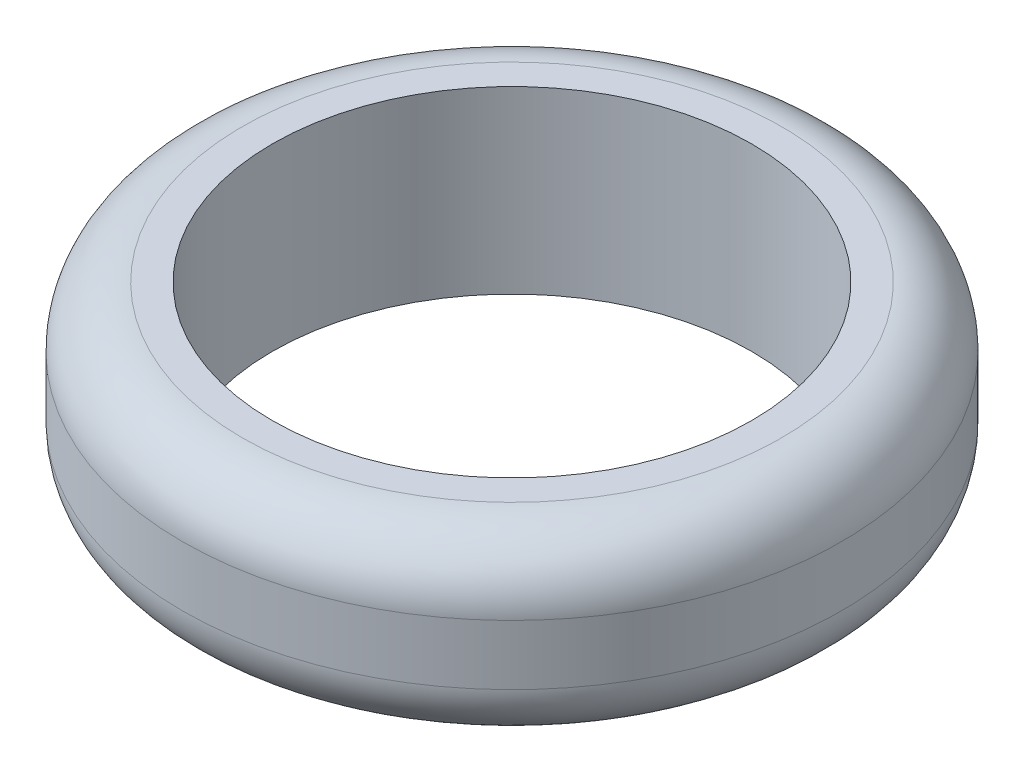
ISO-10303-21;
HEADER;
FILE_DESCRIPTION(('STEP AP214'),'2;1');
FILE_NAME('part.step','',(''),(''),'','','');
FILE_SCHEMA(('AUTOMOTIVE_DESIGN { 1 0 10303 214 1 1 1 1 }'));
ENDSEC;
DATA;
#1=APPLICATION_CONTEXT('core data for automotive mechanical design processes');
#2=APPLICATION_PROTOCOL_DEFINITION('international standard','automotive_design',2000,#1);
#3=PRODUCT_CONTEXT('',#1,'mechanical');
#4=PRODUCT('Part','Part','',(#3));
#5=PRODUCT_RELATED_PRODUCT_CATEGORY('part','',(#4));
#6=PRODUCT_DEFINITION_FORMATION('','',#4);
#7=PRODUCT_DEFINITION_CONTEXT('part definition',#1,'design');
#8=PRODUCT_DEFINITION('design','',#6,#7);
#9=PRODUCT_DEFINITION_SHAPE('','',#8);
#10=(LENGTH_UNIT() NAMED_UNIT(*) SI_UNIT(.MILLI.,.METRE.));
#11=(NAMED_UNIT(*) PLANE_ANGLE_UNIT() SI_UNIT($,.RADIAN.));
#12=(NAMED_UNIT(*) SI_UNIT($,.STERADIAN.) SOLID_ANGLE_UNIT());
#13=UNCERTAINTY_MEASURE_WITH_UNIT(LENGTH_MEASURE(1.E-05),#10,'distance_accuracy_value','');
#14=(GEOMETRIC_REPRESENTATION_CONTEXT(3) GLOBAL_UNCERTAINTY_ASSIGNED_CONTEXT((#13)) GLOBAL_UNIT_ASSIGNED_CONTEXT((#10,
#11,#12)) REPRESENTATION_CONTEXT('',''));
#15=CARTESIAN_POINT('',(0.,0.,0.));
#16=DIRECTION('',(0.,0.,1.));
#17=DIRECTION('',(1.,0.,0.));
#18=AXIS2_PLACEMENT_3D('',#15,#16,#17);
#19=CARTESIAN_POINT('',(0.,3.,0.));
#20=DIRECTION('',(0.,-1.,0.));
#21=DIRECTION('',(0.,0.,-1.));
#22=AXIS2_PLACEMENT_3D('',#19,#20,#21);
#23=CYLINDRICAL_SURFACE('',#22,5.5);
#24=CARTESIAN_POINT('',(0.,1.,0.));
#25=DIRECTION('',(0.,1.,0.));
#26=DIRECTION('',(0.,0.,1.));
#27=AXIS2_PLACEMENT_3D('',#24,#25,#26);
#28=CIRCLE('',#27,5.5);
#29=CARTESIAN_POINT('',(0.,1.,5.5));
#30=VERTEX_POINT('',#29);
#31=EDGE_CURVE('E43',#30,#30,#28,.T.);
#32=ORIENTED_EDGE('',*,*,#31,.T.);
#33=EDGE_LOOP('',(#32));
#34=FACE_BOUND('',#33,.T.);
#35=CARTESIAN_POINT('',(0.,2.,0.));
#36=DIRECTION('',(0.,1.,0.));
#37=DIRECTION('',(0.,0.,1.));
#38=AXIS2_PLACEMENT_3D('',#35,#36,#37);
#39=CIRCLE('',#38,5.5);
#40=CARTESIAN_POINT('',(0.,2.,5.5));
#41=VERTEX_POINT('',#40);
#42=EDGE_CURVE('E47',#41,#41,#39,.F.);
#43=ORIENTED_EDGE('',*,*,#42,.T.);
#44=EDGE_LOOP('',(#43));
#45=FACE_BOUND('',#44,.T.);
#46=ADVANCED_FACE('F36',(#34,#45),#23,.T.);
#47=CARTESIAN_POINT('',(0.,3.,0.));
#48=DIRECTION('',(0.,1.,0.));
#49=DIRECTION('',(0.,0.,1.));
#50=AXIS2_PLACEMENT_3D('',#47,#48,#49);
#51=PLANE('',#50);
#52=CARTESIAN_POINT('',(0.,3.,0.));
#53=DIRECTION('',(0.,1.,0.));
#54=DIRECTION('',(0.,0.,1.));
#55=AXIS2_PLACEMENT_3D('',#52,#53,#54);
#56=CIRCLE('',#55,4.5);
#57=CARTESIAN_POINT('',(0.,3.,4.5));
#58=VERTEX_POINT('',#57);
#59=EDGE_CURVE('E51',#58,#58,#56,.T.);
#60=ORIENTED_EDGE('',*,*,#59,.T.);
#61=EDGE_LOOP('',(#60));
#62=FACE_BOUND('',#61,.T.);
#63=CARTESIAN_POINT('',(0.,3.,0.));
#64=DIRECTION('',(0.,1.,0.));
#65=DIRECTION('',(0.,0.,1.));
#66=AXIS2_PLACEMENT_3D('',#63,#64,#65);
#67=CIRCLE('',#66,4.);
#68=CARTESIAN_POINT('',(0.,3.,4.));
#69=VERTEX_POINT('',#68);
#70=EDGE_CURVE('E59',#69,#69,#67,.T.);
#71=ORIENTED_EDGE('',*,*,#70,.F.);
#72=EDGE_LOOP('',(#71));
#73=FACE_BOUND('',#72,.T.);
#74=ADVANCED_FACE('F66',(#62,#73),#51,.T.);
#75=CARTESIAN_POINT('',(0.,0.,0.));
#76=DIRECTION('',(0.,1.,0.));
#77=DIRECTION('',(0.,0.,1.));
#78=AXIS2_PLACEMENT_3D('',#75,#76,#77);
#79=PLANE('',#78);
#80=CARTESIAN_POINT('',(0.,0.,0.));
#81=DIRECTION('',(0.,1.,0.));
#82=DIRECTION('',(0.,0.,1.));
#83=AXIS2_PLACEMENT_3D('',#80,#81,#82);
#84=CIRCLE('',#83,4.5);
#85=CARTESIAN_POINT('',(0.,0.,4.5));
#86=VERTEX_POINT('',#85);
#87=EDGE_CURVE('E10',#86,#86,#84,.F.);
#88=ORIENTED_EDGE('',*,*,#87,.T.);
#89=EDGE_LOOP('',(#88));
#90=FACE_BOUND('',#89,.T.);
#91=CARTESIAN_POINT('',(0.,0.,0.));
#92=DIRECTION('',(0.,1.,0.));
#93=DIRECTION('',(0.,0.,1.));
#94=AXIS2_PLACEMENT_3D('',#91,#92,#93);
#95=CIRCLE('',#94,4.);
#96=CARTESIAN_POINT('',(0.,0.,4.));
#97=VERTEX_POINT('',#96);
#98=EDGE_CURVE('E56',#97,#97,#95,.T.);
#99=ORIENTED_EDGE('',*,*,#98,.T.);
#100=EDGE_LOOP('',(#99));
#101=FACE_BOUND('',#100,.T.);
#102=ADVANCED_FACE('F68',(#90,#101),#79,.F.);
#103=CARTESIAN_POINT('',(0.,-2.,0.));
#104=DIRECTION('',(0.,1.,0.));
#105=DIRECTION('',(0.,0.,1.));
#106=AXIS2_PLACEMENT_3D('',#103,#104,#105);
#107=CYLINDRICAL_SURFACE('',#106,4.);
#108=ORIENTED_EDGE('',*,*,#70,.T.);
#109=EDGE_LOOP('',(#108));
#110=FACE_BOUND('',#109,.T.);
#111=ORIENTED_EDGE('',*,*,#98,.F.);
#112=EDGE_LOOP('',(#111));
#113=FACE_BOUND('',#112,.T.);
#114=ADVANCED_FACE('F63',(#110,#113),#107,.F.);
#115=CARTESIAN_POINT('',(0.,2.,0.));
#116=DIRECTION('',(0.,1.,0.));
#117=DIRECTION('',(0.,0.,1.));
#118=AXIS2_PLACEMENT_3D('',#115,#116,#117);
#119=TOROIDAL_SURFACE('',#118,4.5,1.);
#120=ORIENTED_EDGE('',*,*,#42,.F.);
#121=EDGE_LOOP('',(#120));
#122=FACE_BOUND('',#121,.T.);
#123=ORIENTED_EDGE('',*,*,#59,.F.);
#124=EDGE_LOOP('',(#123));
#125=FACE_BOUND('',#124,.T.);
#126=ADVANCED_FACE('F78',(#122,#125),#119,.T.);
#127=CARTESIAN_POINT('',(0.,1.,0.));
#128=DIRECTION('',(0.,1.,0.));
#129=DIRECTION('',(0.,0.,1.));
#130=AXIS2_PLACEMENT_3D('',#127,#128,#129);
#131=TOROIDAL_SURFACE('',#130,4.5,1.);
#132=ORIENTED_EDGE('',*,*,#87,.F.);
#133=EDGE_LOOP('',(#132));
#134=FACE_BOUND('',#133,.T.);
#135=ORIENTED_EDGE('',*,*,#31,.F.);
#136=EDGE_LOOP('',(#135));
#137=FACE_BOUND('',#136,.T.);
#138=ADVANCED_FACE('F38',(#134,#137),#131,.T.);
#139=CLOSED_SHELL('',(#46,#74,#102,#114,#126,#138));
#140=MANIFOLD_SOLID_BREP('B2',#139);
#141=ADVANCED_BREP_SHAPE_REPRESENTATION('',(#18,#140),#14);
#142=SHAPE_DEFINITION_REPRESENTATION(#9,#141);
ENDSEC;
END-ISO-10303-21;
